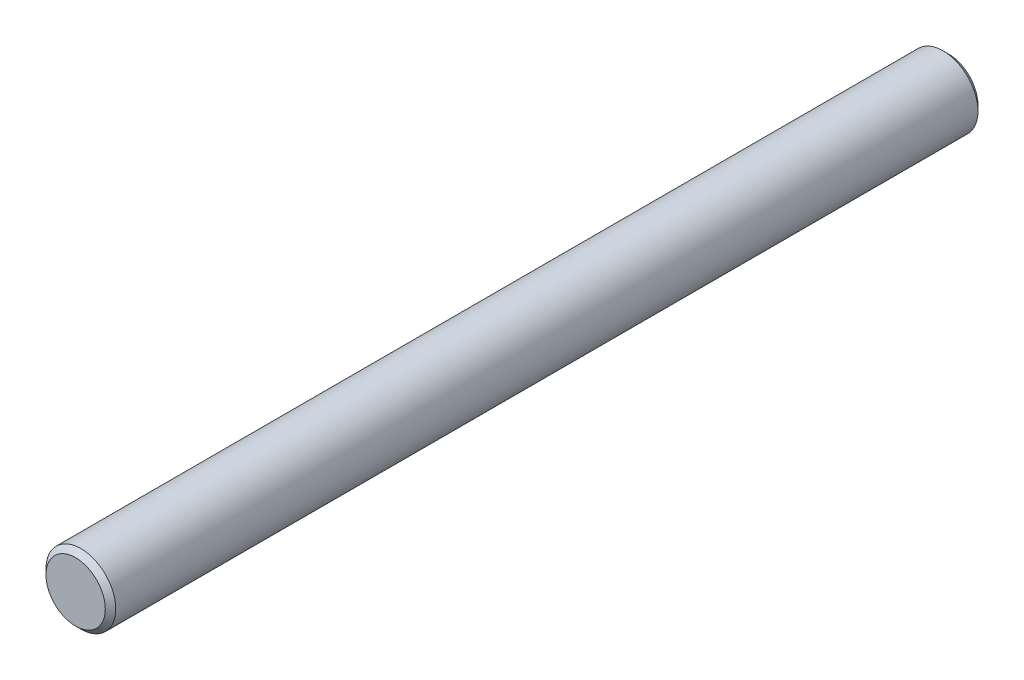
ISO-10303-21;
HEADER;
FILE_DESCRIPTION(('STEP AP214'),'2;1');
FILE_NAME('part.step','',(''),(''),'','','');
FILE_SCHEMA(('AUTOMOTIVE_DESIGN { 1 0 10303 214 1 1 1 1 }'));
ENDSEC;
DATA;
#1=APPLICATION_CONTEXT('core data for automotive mechanical design processes');
#2=APPLICATION_PROTOCOL_DEFINITION('international standard','automotive_design',2000,#1);
#3=PRODUCT_CONTEXT('',#1,'mechanical');
#4=PRODUCT('Part','Part','',(#3));
#5=PRODUCT_RELATED_PRODUCT_CATEGORY('part','',(#4));
#6=PRODUCT_DEFINITION_FORMATION('','',#4);
#7=PRODUCT_DEFINITION_CONTEXT('part definition',#1,'design');
#8=PRODUCT_DEFINITION('design','',#6,#7);
#9=PRODUCT_DEFINITION_SHAPE('','',#8);
#10=(LENGTH_UNIT() NAMED_UNIT(*) SI_UNIT(.MILLI.,.METRE.));
#11=(NAMED_UNIT(*) PLANE_ANGLE_UNIT() SI_UNIT($,.RADIAN.));
#12=(NAMED_UNIT(*) SI_UNIT($,.STERADIAN.) SOLID_ANGLE_UNIT());
#13=UNCERTAINTY_MEASURE_WITH_UNIT(LENGTH_MEASURE(1.E-05),#10,'distance_accuracy_value','');
#14=(GEOMETRIC_REPRESENTATION_CONTEXT(3) GLOBAL_UNCERTAINTY_ASSIGNED_CONTEXT((#13)) GLOBAL_UNIT_ASSIGNED_CONTEXT((#10,
#11,#12)) REPRESENTATION_CONTEXT('',''));
#15=CARTESIAN_POINT('',(0.,0.,0.));
#16=DIRECTION('',(0.,0.,1.));
#17=DIRECTION('',(1.,0.,0.));
#18=AXIS2_PLACEMENT_3D('',#15,#16,#17);
#19=CARTESIAN_POINT('',(0.,0.,50.));
#20=DIRECTION('',(0.,0.,-1.));
#21=DIRECTION('',(-1.,0.,0.));
#22=AXIS2_PLACEMENT_3D('',#19,#20,#21);
#23=CYLINDRICAL_SURFACE('',#22,4.);
#24=CARTESIAN_POINT('',(0.,0.,-49.4));
#25=DIRECTION('',(0.,0.,1.));
#26=DIRECTION('',(1.,0.,0.));
#27=AXIS2_PLACEMENT_3D('',#24,#25,#26);
#28=CIRCLE('',#27,4.);
#29=CARTESIAN_POINT('',(4.,0.,-49.4));
#30=VERTEX_POINT('',#29);
#31=EDGE_CURVE('E56',#30,#30,#28,.T.);
#32=ORIENTED_EDGE('',*,*,#31,.T.);
#33=EDGE_LOOP('',(#32));
#34=FACE_BOUND('',#33,.T.);
#35=CARTESIAN_POINT('',(0.,0.,49.4));
#36=DIRECTION('',(0.,0.,1.));
#37=DIRECTION('',(1.,0.,0.));
#38=AXIS2_PLACEMENT_3D('',#35,#36,#37);
#39=CIRCLE('',#38,4.);
#40=CARTESIAN_POINT('',(4.,0.,49.4));
#41=VERTEX_POINT('',#40);
#42=EDGE_CURVE('E62',#41,#41,#39,.F.);
#43=ORIENTED_EDGE('',*,*,#42,.T.);
#44=EDGE_LOOP('',(#43));
#45=FACE_BOUND('',#44,.T.);
#46=ADVANCED_FACE('F42',(#34,#45),#23,.T.);
#47=CARTESIAN_POINT('',(0.,0.,50.));
#48=DIRECTION('',(0.,0.,1.));
#49=DIRECTION('',(1.,0.,0.));
#50=AXIS2_PLACEMENT_3D('',#47,#48,#49);
#51=PLANE('',#50);
#52=CARTESIAN_POINT('',(0.,0.,50.));
#53=DIRECTION('',(0.,0.,1.));
#54=DIRECTION('',(1.,0.,0.));
#55=AXIS2_PLACEMENT_3D('',#52,#53,#54);
#56=CIRCLE('',#55,3.39999999999999);
#57=CARTESIAN_POINT('',(3.39999999999999,0.,50.));
#58=VERTEX_POINT('',#57);
#59=EDGE_CURVE('E10',#58,#58,#56,.T.);
#60=ORIENTED_EDGE('',*,*,#59,.T.);
#61=EDGE_LOOP('',(#60));
#62=FACE_BOUND('',#61,.T.);
#63=ADVANCED_FACE('F80',(#62),#51,.T.);
#64=CARTESIAN_POINT('',(0.,0.,-50.));
#65=DIRECTION('',(0.,0.,1.));
#66=DIRECTION('',(1.,0.,0.));
#67=AXIS2_PLACEMENT_3D('',#64,#65,#66);
#68=PLANE('',#67);
#69=CARTESIAN_POINT('',(0.,0.,-50.));
#70=DIRECTION('',(0.,0.,1.));
#71=DIRECTION('',(1.,0.,0.));
#72=AXIS2_PLACEMENT_3D('',#69,#70,#71);
#73=CIRCLE('',#72,3.40000000000001);
#74=CARTESIAN_POINT('',(3.40000000000001,0.,-50.));
#75=VERTEX_POINT('',#74);
#76=EDGE_CURVE('E50',#75,#75,#73,.F.);
#77=ORIENTED_EDGE('',*,*,#76,.T.);
#78=EDGE_LOOP('',(#77));
#79=FACE_BOUND('',#78,.T.);
#80=ADVANCED_FACE('F77',(#79),#68,.F.);
#81=CARTESIAN_POINT('',(0.,0.,-49.4));
#82=DIRECTION('',(0.,0.,1.));
#83=DIRECTION('',(1.,0.,0.));
#84=AXIS2_PLACEMENT_3D('',#81,#82,#83);
#85=CONICAL_SURFACE('',#84,4.,0.785398163397445);
#86=ORIENTED_EDGE('',*,*,#76,.F.);
#87=EDGE_LOOP('',(#86));
#88=FACE_BOUND('',#87,.T.);
#89=ORIENTED_EDGE('',*,*,#31,.F.);
#90=EDGE_LOOP('',(#89));
#91=FACE_BOUND('',#90,.T.);
#92=ADVANCED_FACE('F73',(#88,#91),#85,.T.);
#93=CARTESIAN_POINT('',(0.,0.,50.));
#94=DIRECTION('',(0.,0.,-1.));
#95=DIRECTION('',(-1.,0.,0.));
#96=AXIS2_PLACEMENT_3D('',#93,#94,#95);
#97=CONICAL_SURFACE('',#96,3.39999999999999,0.78539816339744);
#98=ORIENTED_EDGE('',*,*,#42,.F.);
#99=EDGE_LOOP('',(#98));
#100=FACE_BOUND('',#99,.T.);
#101=ORIENTED_EDGE('',*,*,#59,.F.);
#102=EDGE_LOOP('',(#101));
#103=FACE_BOUND('',#102,.T.);
#104=ADVANCED_FACE('F44',(#100,#103),#97,.T.);
#105=CLOSED_SHELL('',(#46,#63,#80,#92,#104));
#106=MANIFOLD_SOLID_BREP('B2',#105);
#107=ADVANCED_BREP_SHAPE_REPRESENTATION('',(#18,#106),#14);
#108=SHAPE_DEFINITION_REPRESENTATION(#9,#107);
ENDSEC;
END-ISO-10303-21;
